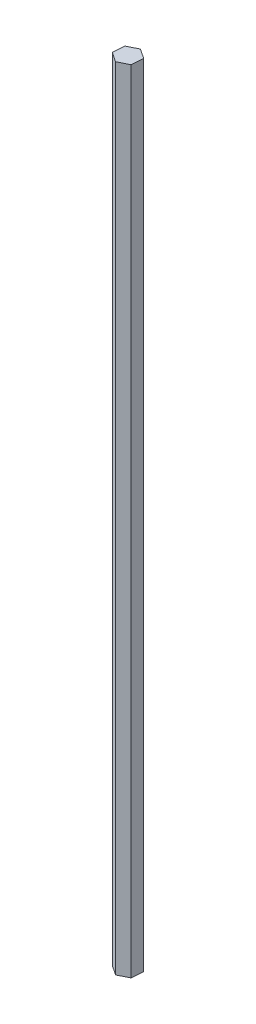
ISO-10303-21;
HEADER;
FILE_DESCRIPTION(('STEP AP214'),'2;1');
FILE_NAME('part.step','',(''),(''),'','','');
FILE_SCHEMA(('AUTOMOTIVE_DESIGN { 1 0 10303 214 1 1 1 1 }'));
ENDSEC;
DATA;
#1=APPLICATION_CONTEXT('core data for automotive mechanical design processes');
#2=APPLICATION_PROTOCOL_DEFINITION('international standard','automotive_design',2000,#1);
#3=PRODUCT_CONTEXT('',#1,'mechanical');
#4=PRODUCT('Part','Part','',(#3));
#5=PRODUCT_RELATED_PRODUCT_CATEGORY('part','',(#4));
#6=PRODUCT_DEFINITION_FORMATION('','',#4);
#7=PRODUCT_DEFINITION_CONTEXT('part definition',#1,'design');
#8=PRODUCT_DEFINITION('design','',#6,#7);
#9=PRODUCT_DEFINITION_SHAPE('','',#8);
#10=(LENGTH_UNIT() NAMED_UNIT(*) SI_UNIT(.MILLI.,.METRE.));
#11=(NAMED_UNIT(*) PLANE_ANGLE_UNIT() SI_UNIT($,.RADIAN.));
#12=(NAMED_UNIT(*) SI_UNIT($,.STERADIAN.) SOLID_ANGLE_UNIT());
#13=UNCERTAINTY_MEASURE_WITH_UNIT(LENGTH_MEASURE(1.E-05),#10,'distance_accuracy_value','');
#14=(GEOMETRIC_REPRESENTATION_CONTEXT(3) GLOBAL_UNCERTAINTY_ASSIGNED_CONTEXT((#13)) GLOBAL_UNIT_ASSIGNED_CONTEXT((#10,
#11,#12)) REPRESENTATION_CONTEXT('',''));
#15=CARTESIAN_POINT('',(0.,0.,0.));
#16=DIRECTION('',(0.,0.,1.));
#17=DIRECTION('',(1.,0.,0.));
#18=AXIS2_PLACEMENT_3D('',#15,#16,#17);
#19=CARTESIAN_POINT('',(-0.477537271379765,247.65,7.31678149788392));
#20=DIRECTION('',(-0.442536436538408,0.,-0.896750524023202));
#21=DIRECTION('',(-0.896750524023202,0.,0.442536436538408));
#22=AXIS2_PLACEMENT_3D('',#19,#20,#21);
#23=PLANE('',#22);
#24=DIRECTION('',(0.896750524023202,0.,-0.442536436538408));
#25=VECTOR('',#24,1.);
#26=CARTESIAN_POINT('',(-0.477537271379765,-247.65,7.31678149788392));
#27=LINE('',#26,#25);
#28=CARTESIAN_POINT('',(-0.477537271379765,-247.65,7.31678149788392));
#29=VERTEX_POINT('',#28);
#30=CARTESIAN_POINT('',(6.09775001541755,-247.65,4.07195015721074));
#31=VERTEX_POINT('',#30);
#32=EDGE_CURVE('E117',#29,#31,#27,.T.);
#33=ORIENTED_EDGE('',*,*,#32,.T.);
#34=DIRECTION('',(0.,-1.,0.));
#35=VECTOR('',#34,1.);
#36=CARTESIAN_POINT('',(6.09775001541755,247.65,4.07195015721074));
#37=LINE('',#36,#35);
#38=CARTESIAN_POINT('',(6.09775001541755,247.65,4.07195015721074));
#39=VERTEX_POINT('',#38);
#40=EDGE_CURVE('E11',#39,#31,#37,.T.);
#41=ORIENTED_EDGE('',*,*,#40,.F.);
#42=DIRECTION('',(0.896750524023202,0.,-0.442536436538408));
#43=VECTOR('',#42,1.);
#44=CARTESIAN_POINT('',(-0.477537271379765,247.65,7.31678149788392));
#45=LINE('',#44,#43);
#46=CARTESIAN_POINT('',(-0.477537271379765,247.65,7.31678149788392));
#47=VERTEX_POINT('',#46);
#48=EDGE_CURVE('E127',#47,#39,#45,.T.);
#49=ORIENTED_EDGE('',*,*,#48,.F.);
#50=DIRECTION('',(0.,-1.,0.));
#51=VECTOR('',#50,1.);
#52=CARTESIAN_POINT('',(-0.477537271379765,247.65,7.31678149788392));
#53=LINE('',#52,#51);
#54=EDGE_CURVE('E113',#47,#29,#53,.T.);
#55=ORIENTED_EDGE('',*,*,#54,.T.);
#56=EDGE_LOOP('',(#33,#41,#49,#55));
#57=FACE_BOUND('',#56,.T.);
#58=ADVANCED_FACE('F33',(#57),#23,.F.);
#59=CARTESIAN_POINT('',(6.09775001541755,247.65,4.07195015721074));
#60=DIRECTION('',(-0.997876952930305,0.,-0.0651274658690995));
#61=DIRECTION('',(-0.0651274658690995,0.,0.997876952930305));
#62=AXIS2_PLACEMENT_3D('',#59,#60,#61);
#63=PLANE('',#62);
#64=DIRECTION('',(0.0651274658690995,0.,-0.997876952930305));
#65=VECTOR('',#64,1.);
#66=CARTESIAN_POINT('',(6.09775001541755,-247.65,4.07195015721074));
#67=LINE('',#66,#65);
#68=CARTESIAN_POINT('',(6.57528728679732,-247.65,-3.24483134067318));
#69=VERTEX_POINT('',#68);
#70=EDGE_CURVE('E120',#31,#69,#67,.T.);
#71=ORIENTED_EDGE('',*,*,#70,.T.);
#72=DIRECTION('',(0.,-1.,0.));
#73=VECTOR('',#72,1.);
#74=CARTESIAN_POINT('',(6.57528728679732,247.65,-3.24483134067318));
#75=LINE('',#74,#73);
#76=CARTESIAN_POINT('',(6.57528728679732,247.65,-3.24483134067318));
#77=VERTEX_POINT('',#76);
#78=EDGE_CURVE('E41',#77,#69,#75,.T.);
#79=ORIENTED_EDGE('',*,*,#78,.F.);
#80=DIRECTION('',(0.0651274658690995,0.,-0.997876952930305));
#81=VECTOR('',#80,1.);
#82=CARTESIAN_POINT('',(6.09775001541755,247.65,4.07195015721074));
#83=LINE('',#82,#81);
#84=EDGE_CURVE('E86',#39,#77,#83,.T.);
#85=ORIENTED_EDGE('',*,*,#84,.F.);
#86=ORIENTED_EDGE('',*,*,#40,.T.);
#87=EDGE_LOOP('',(#71,#79,#85,#86));
#88=FACE_BOUND('',#87,.T.);
#89=ADVANCED_FACE('F151',(#88),#63,.F.);
#90=CARTESIAN_POINT('',(6.57528728679732,247.65,-3.24483134067318));
#91=DIRECTION('',(-0.555340516391897,0.,0.831623058154102));
#92=DIRECTION('',(0.831623058154103,0.,0.555340516391897));
#93=AXIS2_PLACEMENT_3D('',#90,#91,#92);
#94=PLANE('',#93);
#95=DIRECTION('',(-0.831623058154102,0.,-0.555340516391897));
#96=VECTOR('',#95,1.);
#97=CARTESIAN_POINT('',(6.57528728679732,-247.65,-3.24483134067318));
#98=LINE('',#97,#96);
#99=CARTESIAN_POINT('',(0.477537271379769,-247.65,-7.31678149788392));
#100=VERTEX_POINT('',#99);
#101=EDGE_CURVE('E122',#69,#100,#98,.T.);
#102=ORIENTED_EDGE('',*,*,#101,.T.);
#103=DIRECTION('',(0.,-1.,0.));
#104=VECTOR('',#103,1.);
#105=CARTESIAN_POINT('',(0.477537271379769,247.65,-7.31678149788392));
#106=LINE('',#105,#104);
#107=CARTESIAN_POINT('',(0.477537271379769,247.65,-7.31678149788392));
#108=VERTEX_POINT('',#107);
#109=EDGE_CURVE('E108',#108,#100,#106,.T.);
#110=ORIENTED_EDGE('',*,*,#109,.F.);
#111=DIRECTION('',(-0.831623058154102,0.,-0.555340516391897));
#112=VECTOR('',#111,1.);
#113=CARTESIAN_POINT('',(6.57528728679732,247.65,-3.24483134067318));
#114=LINE('',#113,#112);
#115=EDGE_CURVE('E99',#77,#108,#114,.T.);
#116=ORIENTED_EDGE('',*,*,#115,.F.);
#117=ORIENTED_EDGE('',*,*,#78,.T.);
#118=EDGE_LOOP('',(#102,#110,#116,#117));
#119=FACE_BOUND('',#118,.T.);
#120=ADVANCED_FACE('F133',(#119),#94,.F.);
#121=CARTESIAN_POINT('',(0.477537271379769,247.65,-7.31678149788392));
#122=DIRECTION('',(0.442536436538408,0.,0.896750524023202));
#123=DIRECTION('',(0.896750524023202,0.,-0.442536436538408));
#124=AXIS2_PLACEMENT_3D('',#121,#122,#123);
#125=PLANE('',#124);
#126=DIRECTION('',(-0.896750524023202,0.,0.442536436538408));
#127=VECTOR('',#126,1.);
#128=CARTESIAN_POINT('',(0.477537271379769,-247.65,-7.31678149788392));
#129=LINE('',#128,#127);
#130=CARTESIAN_POINT('',(-6.09775001541755,-247.65,-4.07195015721074));
#131=VERTEX_POINT('',#130);
#132=EDGE_CURVE('E107',#100,#131,#129,.T.);
#133=ORIENTED_EDGE('',*,*,#132,.T.);
#134=DIRECTION('',(0.,-1.,0.));
#135=VECTOR('',#134,1.);
#136=CARTESIAN_POINT('',(-6.09775001541755,247.65,-4.07195015721074));
#137=LINE('',#136,#135);
#138=CARTESIAN_POINT('',(-6.09775001541755,247.65,-4.07195015721074));
#139=VERTEX_POINT('',#138);
#140=EDGE_CURVE('E104',#139,#131,#137,.T.);
#141=ORIENTED_EDGE('',*,*,#140,.F.);
#142=DIRECTION('',(-0.896750524023202,0.,0.442536436538408));
#143=VECTOR('',#142,1.);
#144=CARTESIAN_POINT('',(0.477537271379769,247.65,-7.31678149788392));
#145=LINE('',#144,#143);
#146=EDGE_CURVE('E93',#108,#139,#145,.T.);
#147=ORIENTED_EDGE('',*,*,#146,.F.);
#148=ORIENTED_EDGE('',*,*,#109,.T.);
#149=EDGE_LOOP('',(#133,#141,#147,#148));
#150=FACE_BOUND('',#149,.T.);
#151=ADVANCED_FACE('F105',(#150),#125,.F.);
#152=CARTESIAN_POINT('',(-6.09775001541755,247.65,-4.07195015721074));
#153=DIRECTION('',(0.997876952930305,0.,0.0651274658690997));
#154=DIRECTION('',(0.0651274658690997,0.,-0.997876952930305));
#155=AXIS2_PLACEMENT_3D('',#152,#153,#154);
#156=PLANE('',#155);
#157=DIRECTION('',(-0.0651274658690997,0.,0.997876952930305));
#158=VECTOR('',#157,1.);
#159=CARTESIAN_POINT('',(-6.09775001541755,-247.65,-4.07195015721074));
#160=LINE('',#159,#158);
#161=CARTESIAN_POINT('',(-6.57528728679732,-247.65,3.24483134067318));
#162=VERTEX_POINT('',#161);
#163=EDGE_CURVE('E72',#131,#162,#160,.T.);
#164=ORIENTED_EDGE('',*,*,#163,.T.);
#165=DIRECTION('',(0.,-1.,0.));
#166=VECTOR('',#165,1.);
#167=CARTESIAN_POINT('',(-6.57528728679732,247.65,3.24483134067318));
#168=LINE('',#167,#166);
#169=CARTESIAN_POINT('',(-6.57528728679732,247.65,3.24483134067318));
#170=VERTEX_POINT('',#169);
#171=EDGE_CURVE('E109',#170,#162,#168,.T.);
#172=ORIENTED_EDGE('',*,*,#171,.F.);
#173=DIRECTION('',(-0.0651274658690997,0.,0.997876952930305));
#174=VECTOR('',#173,1.);
#175=CARTESIAN_POINT('',(-6.09775001541755,247.65,-4.07195015721074));
#176=LINE('',#175,#174);
#177=EDGE_CURVE('E97',#139,#170,#176,.T.);
#178=ORIENTED_EDGE('',*,*,#177,.F.);
#179=ORIENTED_EDGE('',*,*,#140,.T.);
#180=EDGE_LOOP('',(#164,#172,#178,#179));
#181=FACE_BOUND('',#180,.T.);
#182=ADVANCED_FACE('F111',(#181),#156,.F.);
#183=CARTESIAN_POINT('',(-6.57528728679732,247.65,3.24483134067318));
#184=DIRECTION('',(0.555340516391897,0.,-0.831623058154103));
#185=DIRECTION('',(-0.831623058154103,0.,-0.555340516391897));
#186=AXIS2_PLACEMENT_3D('',#183,#184,#185);
#187=PLANE('',#186);
#188=DIRECTION('',(0.831623058154102,0.,0.555340516391897));
#189=VECTOR('',#188,1.);
#190=CARTESIAN_POINT('',(-6.57528728679732,-247.65,3.24483134067318));
#191=LINE('',#190,#189);
#192=EDGE_CURVE('E78',#162,#29,#191,.T.);
#193=ORIENTED_EDGE('',*,*,#192,.T.);
#194=ORIENTED_EDGE('',*,*,#54,.F.);
#195=DIRECTION('',(0.831623058154102,0.,0.555340516391897));
#196=VECTOR('',#195,1.);
#197=CARTESIAN_POINT('',(-6.57528728679732,247.65,3.24483134067318));
#198=LINE('',#197,#196);
#199=EDGE_CURVE('E49',#170,#47,#198,.T.);
#200=ORIENTED_EDGE('',*,*,#199,.F.);
#201=ORIENTED_EDGE('',*,*,#171,.T.);
#202=EDGE_LOOP('',(#193,#194,#200,#201));
#203=FACE_BOUND('',#202,.T.);
#204=ADVANCED_FACE('F140',(#203),#187,.F.);
#205=CARTESIAN_POINT('',(0.,247.65,0.));
#206=DIRECTION('',(0.,1.,0.));
#207=DIRECTION('',(0.,0.,1.));
#208=AXIS2_PLACEMENT_3D('',#205,#206,#207);
#209=PLANE('',#208);
#210=ORIENTED_EDGE('',*,*,#48,.T.);
#211=ORIENTED_EDGE('',*,*,#84,.T.);
#212=ORIENTED_EDGE('',*,*,#115,.T.);
#213=ORIENTED_EDGE('',*,*,#146,.T.);
#214=ORIENTED_EDGE('',*,*,#177,.T.);
#215=ORIENTED_EDGE('',*,*,#199,.T.);
#216=EDGE_LOOP('',(#210,#211,#212,#213,#214,#215));
#217=FACE_BOUND('',#216,.T.);
#218=ADVANCED_FACE('F95',(#217),#209,.T.);
#219=CARTESIAN_POINT('',(0.,-247.65,0.));
#220=DIRECTION('',(0.,1.,0.));
#221=DIRECTION('',(0.,0.,1.));
#222=AXIS2_PLACEMENT_3D('',#219,#220,#221);
#223=PLANE('',#222);
#224=ORIENTED_EDGE('',*,*,#32,.F.);
#225=ORIENTED_EDGE('',*,*,#192,.F.);
#226=ORIENTED_EDGE('',*,*,#163,.F.);
#227=ORIENTED_EDGE('',*,*,#132,.F.);
#228=ORIENTED_EDGE('',*,*,#101,.F.);
#229=ORIENTED_EDGE('',*,*,#70,.F.);
#230=EDGE_LOOP('',(#224,#225,#226,#227,#228,#229));
#231=FACE_BOUND('',#230,.T.);
#232=ADVANCED_FACE('F136',(#231),#223,.F.);
#233=CLOSED_SHELL('',(#58,#89,#120,#151,#182,#204,#218,#232));
#234=MANIFOLD_SOLID_BREP('B2',#233);
#235=ADVANCED_BREP_SHAPE_REPRESENTATION('',(#18,#234),#14);
#236=SHAPE_DEFINITION_REPRESENTATION(#9,#235);
ENDSEC;
END-ISO-10303-21;
